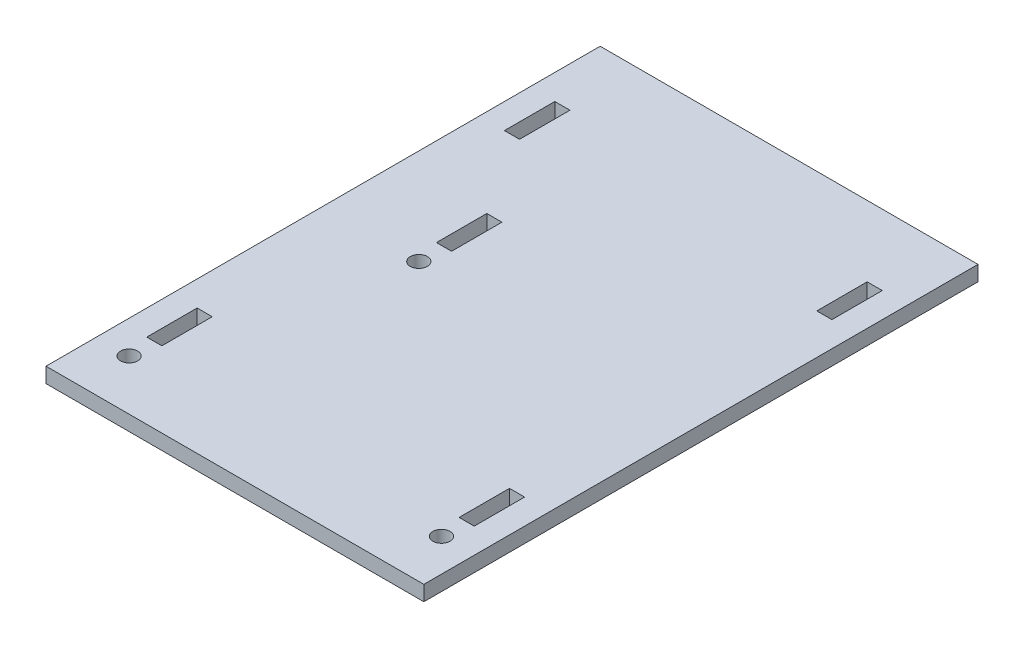
ISO-10303-21;
HEADER;
FILE_DESCRIPTION(('STEP AP214'),'2;1');
FILE_NAME('part.step','',(''),(''),'','','');
FILE_SCHEMA(('AUTOMOTIVE_DESIGN { 1 0 10303 214 1 1 1 1 }'));
ENDSEC;
DATA;
#1=APPLICATION_CONTEXT('core data for automotive mechanical design processes');
#2=APPLICATION_PROTOCOL_DEFINITION('international standard','automotive_design',2000,#1);
#3=PRODUCT_CONTEXT('',#1,'mechanical');
#4=PRODUCT('Part','Part','',(#3));
#5=PRODUCT_RELATED_PRODUCT_CATEGORY('part','',(#4));
#6=PRODUCT_DEFINITION_FORMATION('','',#4);
#7=PRODUCT_DEFINITION_CONTEXT('part definition',#1,'design');
#8=PRODUCT_DEFINITION('design','',#6,#7);
#9=PRODUCT_DEFINITION_SHAPE('','',#8);
#10=(LENGTH_UNIT() NAMED_UNIT(*) SI_UNIT(.MILLI.,.METRE.));
#11=(NAMED_UNIT(*) PLANE_ANGLE_UNIT() SI_UNIT($,.RADIAN.));
#12=(NAMED_UNIT(*) SI_UNIT($,.STERADIAN.) SOLID_ANGLE_UNIT());
#13=UNCERTAINTY_MEASURE_WITH_UNIT(LENGTH_MEASURE(1.E-05),#10,'distance_accuracy_value','');
#14=(GEOMETRIC_REPRESENTATION_CONTEXT(3) GLOBAL_UNCERTAINTY_ASSIGNED_CONTEXT((#13)) GLOBAL_UNIT_ASSIGNED_CONTEXT((#10,
#11,#12)) REPRESENTATION_CONTEXT('',''));
#15=CARTESIAN_POINT('',(0.,0.,0.));
#16=DIRECTION('',(0.,0.,1.));
#17=DIRECTION('',(1.,0.,0.));
#18=AXIS2_PLACEMENT_3D('',#15,#16,#17);
#19=CARTESIAN_POINT('',(0.,3.,0.));
#20=DIRECTION('',(1.,0.,0.));
#21=DIRECTION('',(0.,0.,-1.));
#22=AXIS2_PLACEMENT_3D('',#19,#20,#21);
#23=PLANE('',#22);
#24=DIRECTION('',(0.,0.,1.));
#25=VECTOR('',#24,1.);
#26=CARTESIAN_POINT('',(0.,0.,0.));
#27=LINE('',#26,#25);
#28=CARTESIAN_POINT('',(0.,0.,-110.));
#29=VERTEX_POINT('',#28);
#30=CARTESIAN_POINT('',(0.,0.,0.));
#31=VERTEX_POINT('',#30);
#32=EDGE_CURVE('E357',#29,#31,#27,.T.);
#33=ORIENTED_EDGE('',*,*,#32,.T.);
#34=DIRECTION('',(0.,-1.,0.));
#35=VECTOR('',#34,1.);
#36=CARTESIAN_POINT('',(0.,3.,0.));
#37=LINE('',#36,#35);
#38=CARTESIAN_POINT('',(0.,3.,0.));
#39=VERTEX_POINT('',#38);
#40=EDGE_CURVE('E11',#39,#31,#37,.T.);
#41=ORIENTED_EDGE('',*,*,#40,.F.);
#42=DIRECTION('',(0.,0.,1.));
#43=VECTOR('',#42,1.);
#44=CARTESIAN_POINT('',(0.,3.,0.));
#45=LINE('',#44,#43);
#46=CARTESIAN_POINT('',(0.,3.,-110.));
#47=VERTEX_POINT('',#46);
#48=EDGE_CURVE('E364',#47,#39,#45,.T.);
#49=ORIENTED_EDGE('',*,*,#48,.F.);
#50=DIRECTION('',(0.,-1.,0.));
#51=VECTOR('',#50,1.);
#52=CARTESIAN_POINT('',(0.,3.,-110.));
#53=LINE('',#52,#51);
#54=EDGE_CURVE('E374',#47,#29,#53,.T.);
#55=ORIENTED_EDGE('',*,*,#54,.T.);
#56=EDGE_LOOP('',(#33,#41,#49,#55));
#57=FACE_BOUND('',#56,.T.);
#58=ADVANCED_FACE('F33',(#57),#23,.F.);
#59=CARTESIAN_POINT('',(0.,3.,0.));
#60=DIRECTION('',(0.,0.,-1.));
#61=DIRECTION('',(-1.,0.,0.));
#62=AXIS2_PLACEMENT_3D('',#59,#60,#61);
#63=PLANE('',#62);
#64=DIRECTION('',(1.,0.,0.));
#65=VECTOR('',#64,1.);
#66=CARTESIAN_POINT('',(0.,0.,0.));
#67=LINE('',#66,#65);
#68=CARTESIAN_POINT('',(75.,0.,0.));
#69=VERTEX_POINT('',#68);
#70=EDGE_CURVE('E377',#31,#69,#67,.T.);
#71=ORIENTED_EDGE('',*,*,#70,.T.);
#72=DIRECTION('',(0.,-1.,0.));
#73=VECTOR('',#72,1.);
#74=CARTESIAN_POINT('',(75.,3.,0.));
#75=LINE('',#74,#73);
#76=CARTESIAN_POINT('',(75.,3.,0.));
#77=VERTEX_POINT('',#76);
#78=EDGE_CURVE('E40',#77,#69,#75,.T.);
#79=ORIENTED_EDGE('',*,*,#78,.F.);
#80=DIRECTION('',(1.,0.,0.));
#81=VECTOR('',#80,1.);
#82=CARTESIAN_POINT('',(0.,3.,0.));
#83=LINE('',#82,#81);
#84=EDGE_CURVE('E367',#39,#77,#83,.T.);
#85=ORIENTED_EDGE('',*,*,#84,.F.);
#86=ORIENTED_EDGE('',*,*,#40,.T.);
#87=EDGE_LOOP('',(#71,#79,#85,#86));
#88=FACE_BOUND('',#87,.T.);
#89=ADVANCED_FACE('F406',(#88),#63,.F.);
#90=CARTESIAN_POINT('',(75.,3.,0.));
#91=DIRECTION('',(-1.,0.,0.));
#92=DIRECTION('',(0.,0.,1.));
#93=AXIS2_PLACEMENT_3D('',#90,#91,#92);
#94=PLANE('',#93);
#95=DIRECTION('',(0.,0.,-1.));
#96=VECTOR('',#95,1.);
#97=CARTESIAN_POINT('',(75.,0.,0.));
#98=LINE('',#97,#96);
#99=CARTESIAN_POINT('',(75.,0.,-110.));
#100=VERTEX_POINT('',#99);
#101=EDGE_CURVE('E379',#69,#100,#98,.T.);
#102=ORIENTED_EDGE('',*,*,#101,.T.);
#103=DIRECTION('',(0.,-1.,0.));
#104=VECTOR('',#103,1.);
#105=CARTESIAN_POINT('',(75.,3.,-110.));
#106=LINE('',#105,#104);
#107=CARTESIAN_POINT('',(75.,3.,-110.));
#108=VERTEX_POINT('',#107);
#109=EDGE_CURVE('E384',#108,#100,#106,.T.);
#110=ORIENTED_EDGE('',*,*,#109,.F.);
#111=DIRECTION('',(0.,0.,-1.));
#112=VECTOR('',#111,1.);
#113=CARTESIAN_POINT('',(75.,3.,0.));
#114=LINE('',#113,#112);
#115=EDGE_CURVE('E370',#77,#108,#114,.T.);
#116=ORIENTED_EDGE('',*,*,#115,.F.);
#117=ORIENTED_EDGE('',*,*,#78,.T.);
#118=EDGE_LOOP('',(#102,#110,#116,#117));
#119=FACE_BOUND('',#118,.T.);
#120=ADVANCED_FACE('F391',(#119),#94,.F.);
#121=CARTESIAN_POINT('',(0.,3.,-110.));
#122=DIRECTION('',(0.,0.,1.));
#123=DIRECTION('',(1.,0.,0.));
#124=AXIS2_PLACEMENT_3D('',#121,#122,#123);
#125=PLANE('',#124);
#126=DIRECTION('',(-1.,0.,0.));
#127=VECTOR('',#126,1.);
#128=CARTESIAN_POINT('',(0.,0.,-110.));
#129=LINE('',#128,#127);
#130=EDGE_CURVE('E368',#100,#29,#129,.T.);
#131=ORIENTED_EDGE('',*,*,#130,.T.);
#132=ORIENTED_EDGE('',*,*,#54,.F.);
#133=DIRECTION('',(-1.,0.,0.));
#134=VECTOR('',#133,1.);
#135=CARTESIAN_POINT('',(0.,3.,-110.));
#136=LINE('',#135,#134);
#137=EDGE_CURVE('E372',#108,#47,#136,.T.);
#138=ORIENTED_EDGE('',*,*,#137,.F.);
#139=ORIENTED_EDGE('',*,*,#109,.T.);
#140=EDGE_LOOP('',(#131,#132,#138,#139));
#141=FACE_BOUND('',#140,.T.);
#142=ADVANCED_FACE('F399',(#141),#125,.F.);
#143=CARTESIAN_POINT('',(0.,3.,0.));
#144=DIRECTION('',(0.,-1.,0.));
#145=DIRECTION('',(0.,0.,-1.));
#146=AXIS2_PLACEMENT_3D('',#143,#144,#145);
#147=PLANE('',#146);
#148=CARTESIAN_POINT('',(6.5,3.,-9.99999999999999));
#149=DIRECTION('',(0.,1.,0.));
#150=DIRECTION('',(0.,0.,1.));
#151=AXIS2_PLACEMENT_3D('',#148,#149,#150);
#152=CIRCLE('',#151,1.69999999999999);
#153=CARTESIAN_POINT('',(6.5,3.,-8.30000000000001));
#154=VERTEX_POINT('',#153);
#155=EDGE_CURVE('E515',#154,#154,#152,.T.);
#156=ORIENTED_EDGE('',*,*,#155,.F.);
#157=EDGE_LOOP('',(#156));
#158=FACE_BOUND('',#157,.T.);
#159=CARTESIAN_POINT('',(68.5,3.,-10.));
#160=DIRECTION('',(0.,1.,0.));
#161=DIRECTION('',(0.,0.,1.));
#162=AXIS2_PLACEMENT_3D('',#159,#160,#161);
#163=CIRCLE('',#162,1.69999999999999);
#164=CARTESIAN_POINT('',(68.5,3.,-8.30000000000001));
#165=VERTEX_POINT('',#164);
#166=EDGE_CURVE('E517',#165,#165,#163,.T.);
#167=ORIENTED_EDGE('',*,*,#166,.F.);
#168=EDGE_LOOP('',(#167));
#169=FACE_BOUND('',#168,.T.);
#170=CARTESIAN_POINT('',(19.,3.,-55.));
#171=DIRECTION('',(0.,1.,0.));
#172=DIRECTION('',(0.,0.,1.));
#173=AXIS2_PLACEMENT_3D('',#170,#171,#172);
#174=CIRCLE('',#173,1.69999999999999);
#175=CARTESIAN_POINT('',(19.,3.,-53.3));
#176=VERTEX_POINT('',#175);
#177=EDGE_CURVE('E524',#176,#176,#174,.T.);
#178=ORIENTED_EDGE('',*,*,#177,.F.);
#179=EDGE_LOOP('',(#178));
#180=FACE_BOUND('',#179,.T.);
#181=DIRECTION('',(1.,0.,0.));
#182=VECTOR('',#181,1.);
#183=CARTESIAN_POINT('',(5.00000000000011,3.,-15.));
#184=LINE('',#183,#182);
#185=CARTESIAN_POINT('',(5.00000000000011,3.,-15.));
#186=VERTEX_POINT('',#185);
#187=CARTESIAN_POINT('',(8.00000000000011,3.,-15.));
#188=VERTEX_POINT('',#187);
#189=EDGE_CURVE('E318',#186,#188,#184,.T.);
#190=ORIENTED_EDGE('',*,*,#189,.F.);
#191=DIRECTION('',(0.,0.,1.));
#192=VECTOR('',#191,1.);
#193=CARTESIAN_POINT('',(5.00000000000011,3.,-25.));
#194=LINE('',#193,#192);
#195=CARTESIAN_POINT('',(5.00000000000011,3.,-25.));
#196=VERTEX_POINT('',#195);
#197=EDGE_CURVE('E47',#196,#186,#194,.T.);
#198=ORIENTED_EDGE('',*,*,#197,.F.);
#199=DIRECTION('',(-1.,0.,0.));
#200=VECTOR('',#199,1.);
#201=CARTESIAN_POINT('',(5.00000000000011,3.,-25.));
#202=LINE('',#201,#200);
#203=CARTESIAN_POINT('',(8.00000000000011,3.,-25.));
#204=VERTEX_POINT('',#203);
#205=EDGE_CURVE('E307',#204,#196,#202,.T.);
#206=ORIENTED_EDGE('',*,*,#205,.F.);
#207=DIRECTION('',(0.,0.,-1.));
#208=VECTOR('',#207,1.);
#209=CARTESIAN_POINT('',(8.00000000000011,3.,-25.));
#210=LINE('',#209,#208);
#211=EDGE_CURVE('E321',#188,#204,#210,.T.);
#212=ORIENTED_EDGE('',*,*,#211,.F.);
#213=EDGE_LOOP('',(#190,#198,#206,#212));
#214=FACE_BOUND('',#213,.T.);
#215=DIRECTION('',(1.,0.,0.));
#216=VECTOR('',#215,1.);
#217=CARTESIAN_POINT('',(67.,3.,-14.9999999999998));
#218=LINE('',#217,#216);
#219=CARTESIAN_POINT('',(67.,3.,-14.9999999999998));
#220=VERTEX_POINT('',#219);
#221=CARTESIAN_POINT('',(70.,3.,-14.9999999999998));
#222=VERTEX_POINT('',#221);
#223=EDGE_CURVE('E288',#220,#222,#218,.T.);
#224=ORIENTED_EDGE('',*,*,#223,.F.);
#225=DIRECTION('',(0.,0.,1.));
#226=VECTOR('',#225,1.);
#227=CARTESIAN_POINT('',(67.,3.,-24.9999999999998));
#228=LINE('',#227,#226);
#229=CARTESIAN_POINT('',(67.,3.,-24.9999999999998));
#230=VERTEX_POINT('',#229);
#231=EDGE_CURVE('E55',#230,#220,#228,.T.);
#232=ORIENTED_EDGE('',*,*,#231,.F.);
#233=DIRECTION('',(-1.,0.,0.));
#234=VECTOR('',#233,1.);
#235=CARTESIAN_POINT('',(67.,3.,-24.9999999999998));
#236=LINE('',#235,#234);
#237=CARTESIAN_POINT('',(70.,3.,-24.9999999999998));
#238=VERTEX_POINT('',#237);
#239=EDGE_CURVE('E277',#238,#230,#236,.T.);
#240=ORIENTED_EDGE('',*,*,#239,.F.);
#241=DIRECTION('',(0.,0.,-1.));
#242=VECTOR('',#241,1.);
#243=CARTESIAN_POINT('',(70.,3.,-24.9999999999998));
#244=LINE('',#243,#242);
#245=EDGE_CURVE('E292',#222,#238,#244,.T.);
#246=ORIENTED_EDGE('',*,*,#245,.F.);
#247=EDGE_LOOP('',(#224,#232,#240,#246));
#248=FACE_BOUND('',#247,.T.);
#249=DIRECTION('',(1.,0.,0.));
#250=VECTOR('',#249,1.);
#251=CARTESIAN_POINT('',(67.0000000002227,3.,-85.9999999999979));
#252=LINE('',#251,#250);
#253=CARTESIAN_POINT('',(67.0000000002227,3.,-85.9999999999979));
#254=VERTEX_POINT('',#253);
#255=CARTESIAN_POINT('',(70.0000000002227,3.,-85.9999999999979));
#256=VERTEX_POINT('',#255);
#257=EDGE_CURVE('E257',#254,#256,#252,.T.);
#258=ORIENTED_EDGE('',*,*,#257,.F.);
#259=DIRECTION('',(0.,0.,1.));
#260=VECTOR('',#259,1.);
#261=CARTESIAN_POINT('',(67.0000000002227,3.,-95.9999999999979));
#262=LINE('',#261,#260);
#263=CARTESIAN_POINT('',(67.0000000002227,3.,-95.9999999999979));
#264=VERTEX_POINT('',#263);
#265=EDGE_CURVE('E255',#264,#254,#262,.T.);
#266=ORIENTED_EDGE('',*,*,#265,.F.);
#267=DIRECTION('',(-1.,0.,0.));
#268=VECTOR('',#267,1.);
#269=CARTESIAN_POINT('',(67.0000000002227,3.,-95.9999999999979));
#270=LINE('',#269,#268);
#271=CARTESIAN_POINT('',(70.0000000002227,3.,-95.9999999999979));
#272=VERTEX_POINT('',#271);
#273=EDGE_CURVE('E245',#272,#264,#270,.T.);
#274=ORIENTED_EDGE('',*,*,#273,.F.);
#275=DIRECTION('',(0.,0.,-1.));
#276=VECTOR('',#275,1.);
#277=CARTESIAN_POINT('',(70.0000000002227,3.,-95.9999999999979));
#278=LINE('',#277,#276);
#279=EDGE_CURVE('E261',#256,#272,#278,.T.);
#280=ORIENTED_EDGE('',*,*,#279,.F.);
#281=EDGE_LOOP('',(#258,#266,#274,#280));
#282=FACE_BOUND('',#281,.T.);
#283=DIRECTION('',(-1.,0.,0.));
#284=VECTOR('',#283,1.);
#285=CARTESIAN_POINT('',(20.499999999949,3.,-70.0000000000143));
#286=LINE('',#285,#284);
#287=CARTESIAN_POINT('',(20.499999999949,3.,-70.0000000000143));
#288=VERTEX_POINT('',#287);
#289=CARTESIAN_POINT('',(17.499999999949,3.,-70.0000000000143));
#290=VERTEX_POINT('',#289);
#291=EDGE_CURVE('E230',#288,#290,#286,.T.);
#292=ORIENTED_EDGE('',*,*,#291,.F.);
#293=DIRECTION('',(0.,0.,-1.));
#294=VECTOR('',#293,1.);
#295=CARTESIAN_POINT('',(20.499999999949,3.,-60.0000000000143));
#296=LINE('',#295,#294);
#297=CARTESIAN_POINT('',(20.499999999949,3.,-60.0000000000143));
#298=VERTEX_POINT('',#297);
#299=EDGE_CURVE('E200',#298,#288,#296,.T.);
#300=ORIENTED_EDGE('',*,*,#299,.F.);
#301=DIRECTION('',(1.,0.,0.));
#302=VECTOR('',#301,1.);
#303=CARTESIAN_POINT('',(20.499999999949,3.,-60.0000000000143));
#304=LINE('',#303,#302);
#305=CARTESIAN_POINT('',(17.499999999949,3.,-60.0000000000143));
#306=VERTEX_POINT('',#305);
#307=EDGE_CURVE('E218',#306,#298,#304,.T.);
#308=ORIENTED_EDGE('',*,*,#307,.F.);
#309=DIRECTION('',(0.,0.,1.));
#310=VECTOR('',#309,1.);
#311=CARTESIAN_POINT('',(17.499999999949,3.,-60.0000000000143));
#312=LINE('',#311,#310);
#313=EDGE_CURVE('E221',#290,#306,#312,.T.);
#314=ORIENTED_EDGE('',*,*,#313,.F.);
#315=EDGE_LOOP('',(#292,#300,#308,#314));
#316=FACE_BOUND('',#315,.T.);
#317=DIRECTION('',(1.,0.,0.));
#318=VECTOR('',#317,1.);
#319=CARTESIAN_POINT('',(4.99999999995264,3.,-86.0000000000131));
#320=LINE('',#319,#318);
#321=CARTESIAN_POINT('',(4.99999999995264,3.,-86.0000000000131));
#322=VERTEX_POINT('',#321);
#323=CARTESIAN_POINT('',(7.99999999995265,3.,-86.0000000000131));
#324=VERTEX_POINT('',#323);
#325=EDGE_CURVE('E347',#322,#324,#320,.T.);
#326=ORIENTED_EDGE('',*,*,#325,.F.);
#327=DIRECTION('',(0.,0.,1.));
#328=VECTOR('',#327,1.);
#329=CARTESIAN_POINT('',(4.99999999995265,3.,-96.0000000000131));
#330=LINE('',#329,#328);
#331=CARTESIAN_POINT('',(4.99999999995265,3.,-96.0000000000131));
#332=VERTEX_POINT('',#331);
#333=EDGE_CURVE('E237',#332,#322,#330,.T.);
#334=ORIENTED_EDGE('',*,*,#333,.F.);
#335=DIRECTION('',(-1.,0.,0.));
#336=VECTOR('',#335,1.);
#337=CARTESIAN_POINT('',(4.99999999995265,3.,-96.0000000000131));
#338=LINE('',#337,#336);
#339=CARTESIAN_POINT('',(7.99999999995264,3.,-96.0000000000131));
#340=VERTEX_POINT('',#339);
#341=EDGE_CURVE('E336',#340,#332,#338,.T.);
#342=ORIENTED_EDGE('',*,*,#341,.F.);
#343=DIRECTION('',(0.,0.,-1.));
#344=VECTOR('',#343,1.);
#345=CARTESIAN_POINT('',(7.99999999995264,3.,-96.0000000000131));
#346=LINE('',#345,#344);
#347=EDGE_CURVE('E350',#324,#340,#346,.T.);
#348=ORIENTED_EDGE('',*,*,#347,.F.);
#349=EDGE_LOOP('',(#326,#334,#342,#348));
#350=FACE_BOUND('',#349,.T.);
#351=ORIENTED_EDGE('',*,*,#48,.T.);
#352=ORIENTED_EDGE('',*,*,#84,.T.);
#353=ORIENTED_EDGE('',*,*,#115,.T.);
#354=ORIENTED_EDGE('',*,*,#137,.T.);
#355=EDGE_LOOP('',(#351,#352,#353,#354));
#356=FACE_BOUND('',#355,.T.);
#357=ADVANCED_FACE('F405',(#158,#169,#180,#214,#248,#282,#316,#350,#356),#147,.F.);
#358=CARTESIAN_POINT('',(0.,0.,0.));
#359=DIRECTION('',(0.,-1.,0.));
#360=DIRECTION('',(0.,0.,-1.));
#361=AXIS2_PLACEMENT_3D('',#358,#359,#360);
#362=PLANE('',#361);
#363=CARTESIAN_POINT('',(6.5,0.,-9.99999999999999));
#364=DIRECTION('',(0.,1.,0.));
#365=DIRECTION('',(0.,0.,1.));
#366=AXIS2_PLACEMENT_3D('',#363,#364,#365);
#367=CIRCLE('',#366,1.69999999999999);
#368=CARTESIAN_POINT('',(6.5,0.,-8.30000000000001));
#369=VERTEX_POINT('',#368);
#370=EDGE_CURVE('E512',#369,#369,#367,.T.);
#371=ORIENTED_EDGE('',*,*,#370,.T.);
#372=EDGE_LOOP('',(#371));
#373=FACE_BOUND('',#372,.T.);
#374=CARTESIAN_POINT('',(68.5,0.,-10.));
#375=DIRECTION('',(0.,1.,0.));
#376=DIRECTION('',(0.,0.,1.));
#377=AXIS2_PLACEMENT_3D('',#374,#375,#376);
#378=CIRCLE('',#377,1.69999999999999);
#379=CARTESIAN_POINT('',(68.5,0.,-8.30000000000001));
#380=VERTEX_POINT('',#379);
#381=EDGE_CURVE('E522',#380,#380,#378,.T.);
#382=ORIENTED_EDGE('',*,*,#381,.T.);
#383=EDGE_LOOP('',(#382));
#384=FACE_BOUND('',#383,.T.);
#385=CARTESIAN_POINT('',(19.,0.,-55.));
#386=DIRECTION('',(0.,1.,0.));
#387=DIRECTION('',(0.,0.,1.));
#388=AXIS2_PLACEMENT_3D('',#385,#386,#387);
#389=CIRCLE('',#388,1.69999999999999);
#390=CARTESIAN_POINT('',(19.,0.,-53.3));
#391=VERTEX_POINT('',#390);
#392=EDGE_CURVE('E224',#391,#391,#389,.T.);
#393=ORIENTED_EDGE('',*,*,#392,.T.);
#394=EDGE_LOOP('',(#393));
#395=FACE_BOUND('',#394,.T.);
#396=DIRECTION('',(0.,0.,1.));
#397=VECTOR('',#396,1.);
#398=CARTESIAN_POINT('',(5.00000000000011,0.,-25.));
#399=LINE('',#398,#397);
#400=CARTESIAN_POINT('',(5.00000000000011,0.,-25.));
#401=VERTEX_POINT('',#400);
#402=CARTESIAN_POINT('',(5.00000000000011,0.,-15.));
#403=VERTEX_POINT('',#402);
#404=EDGE_CURVE('E303',#401,#403,#399,.T.);
#405=ORIENTED_EDGE('',*,*,#404,.T.);
#406=DIRECTION('',(1.,0.,0.));
#407=VECTOR('',#406,1.);
#408=CARTESIAN_POINT('',(5.00000000000011,0.,-15.));
#409=LINE('',#408,#407);
#410=CARTESIAN_POINT('',(8.00000000000011,0.,-15.));
#411=VERTEX_POINT('',#410);
#412=EDGE_CURVE('E306',#403,#411,#409,.T.);
#413=ORIENTED_EDGE('',*,*,#412,.T.);
#414=DIRECTION('',(0.,0.,-1.));
#415=VECTOR('',#414,1.);
#416=CARTESIAN_POINT('',(8.00000000000011,0.,-25.));
#417=LINE('',#416,#415);
#418=CARTESIAN_POINT('',(8.00000000000011,0.,-25.));
#419=VERTEX_POINT('',#418);
#420=EDGE_CURVE('E310',#411,#419,#417,.T.);
#421=ORIENTED_EDGE('',*,*,#420,.T.);
#422=DIRECTION('',(-1.,0.,0.));
#423=VECTOR('',#422,1.);
#424=CARTESIAN_POINT('',(5.00000000000011,0.,-25.));
#425=LINE('',#424,#423);
#426=EDGE_CURVE('E313',#419,#401,#425,.T.);
#427=ORIENTED_EDGE('',*,*,#426,.T.);
#428=EDGE_LOOP('',(#405,#413,#421,#427));
#429=FACE_BOUND('',#428,.T.);
#430=DIRECTION('',(0.,0.,1.));
#431=VECTOR('',#430,1.);
#432=CARTESIAN_POINT('',(67.,0.,-24.9999999999998));
#433=LINE('',#432,#431);
#434=CARTESIAN_POINT('',(67.,0.,-24.9999999999998));
#435=VERTEX_POINT('',#434);
#436=CARTESIAN_POINT('',(67.,0.,-14.9999999999998));
#437=VERTEX_POINT('',#436);
#438=EDGE_CURVE('E273',#435,#437,#433,.T.);
#439=ORIENTED_EDGE('',*,*,#438,.T.);
#440=DIRECTION('',(1.,0.,0.));
#441=VECTOR('',#440,1.);
#442=CARTESIAN_POINT('',(67.,0.,-14.9999999999998));
#443=LINE('',#442,#441);
#444=CARTESIAN_POINT('',(70.,0.,-14.9999999999998));
#445=VERTEX_POINT('',#444);
#446=EDGE_CURVE('E276',#437,#445,#443,.T.);
#447=ORIENTED_EDGE('',*,*,#446,.T.);
#448=DIRECTION('',(0.,0.,-1.));
#449=VECTOR('',#448,1.);
#450=CARTESIAN_POINT('',(70.,0.,-24.9999999999998));
#451=LINE('',#450,#449);
#452=CARTESIAN_POINT('',(70.,0.,-24.9999999999998));
#453=VERTEX_POINT('',#452);
#454=EDGE_CURVE('E280',#445,#453,#451,.T.);
#455=ORIENTED_EDGE('',*,*,#454,.T.);
#456=DIRECTION('',(-1.,0.,0.));
#457=VECTOR('',#456,1.);
#458=CARTESIAN_POINT('',(67.,0.,-24.9999999999998));
#459=LINE('',#458,#457);
#460=EDGE_CURVE('E283',#453,#435,#459,.T.);
#461=ORIENTED_EDGE('',*,*,#460,.T.);
#462=EDGE_LOOP('',(#439,#447,#455,#461));
#463=FACE_BOUND('',#462,.T.);
#464=DIRECTION('',(0.,0.,1.));
#465=VECTOR('',#464,1.);
#466=CARTESIAN_POINT('',(67.0000000002227,0.,-95.9999999999979));
#467=LINE('',#466,#465);
#468=CARTESIAN_POINT('',(67.0000000002227,0.,-95.9999999999979));
#469=VERTEX_POINT('',#468);
#470=CARTESIAN_POINT('',(67.0000000002227,0.,-85.9999999999979));
#471=VERTEX_POINT('',#470);
#472=EDGE_CURVE('E241',#469,#471,#467,.T.);
#473=ORIENTED_EDGE('',*,*,#472,.T.);
#474=DIRECTION('',(1.,0.,0.));
#475=VECTOR('',#474,1.);
#476=CARTESIAN_POINT('',(67.0000000002227,0.,-85.9999999999979));
#477=LINE('',#476,#475);
#478=CARTESIAN_POINT('',(70.0000000002227,0.,-85.9999999999979));
#479=VERTEX_POINT('',#478);
#480=EDGE_CURVE('E244',#471,#479,#477,.T.);
#481=ORIENTED_EDGE('',*,*,#480,.T.);
#482=DIRECTION('',(0.,0.,-1.));
#483=VECTOR('',#482,1.);
#484=CARTESIAN_POINT('',(70.0000000002227,0.,-95.9999999999979));
#485=LINE('',#484,#483);
#486=CARTESIAN_POINT('',(70.0000000002227,0.,-95.9999999999979));
#487=VERTEX_POINT('',#486);
#488=EDGE_CURVE('E248',#479,#487,#485,.T.);
#489=ORIENTED_EDGE('',*,*,#488,.T.);
#490=DIRECTION('',(-1.,0.,0.));
#491=VECTOR('',#490,1.);
#492=CARTESIAN_POINT('',(67.0000000002227,0.,-95.9999999999979));
#493=LINE('',#492,#491);
#494=EDGE_CURVE('E251',#487,#469,#493,.T.);
#495=ORIENTED_EDGE('',*,*,#494,.T.);
#496=EDGE_LOOP('',(#473,#481,#489,#495));
#497=FACE_BOUND('',#496,.T.);
#498=DIRECTION('',(0.,0.,-1.));
#499=VECTOR('',#498,1.);
#500=CARTESIAN_POINT('',(20.499999999949,0.,-60.0000000000143));
#501=LINE('',#500,#499);
#502=CARTESIAN_POINT('',(20.499999999949,0.,-60.0000000000143));
#503=VERTEX_POINT('',#502);
#504=CARTESIAN_POINT('',(20.499999999949,0.,-70.0000000000143));
#505=VERTEX_POINT('',#504);
#506=EDGE_CURVE('E197',#503,#505,#501,.T.);
#507=ORIENTED_EDGE('',*,*,#506,.T.);
#508=DIRECTION('',(-1.,0.,0.));
#509=VECTOR('',#508,1.);
#510=CARTESIAN_POINT('',(20.499999999949,0.,-70.0000000000143));
#511=LINE('',#510,#509);
#512=CARTESIAN_POINT('',(17.499999999949,0.,-70.0000000000143));
#513=VERTEX_POINT('',#512);
#514=EDGE_CURVE('E209',#505,#513,#511,.T.);
#515=ORIENTED_EDGE('',*,*,#514,.T.);
#516=DIRECTION('',(0.,0.,1.));
#517=VECTOR('',#516,1.);
#518=CARTESIAN_POINT('',(17.499999999949,0.,-60.0000000000143));
#519=LINE('',#518,#517);
#520=CARTESIAN_POINT('',(17.499999999949,0.,-60.0000000000143));
#521=VERTEX_POINT('',#520);
#522=EDGE_CURVE('E213',#513,#521,#519,.T.);
#523=ORIENTED_EDGE('',*,*,#522,.T.);
#524=DIRECTION('',(1.,0.,0.));
#525=VECTOR('',#524,1.);
#526=CARTESIAN_POINT('',(20.499999999949,0.,-60.0000000000143));
#527=LINE('',#526,#525);
#528=EDGE_CURVE('E205',#521,#503,#527,.T.);
#529=ORIENTED_EDGE('',*,*,#528,.T.);
#530=EDGE_LOOP('',(#507,#515,#523,#529));
#531=FACE_BOUND('',#530,.T.);
#532=DIRECTION('',(0.,0.,1.));
#533=VECTOR('',#532,1.);
#534=CARTESIAN_POINT('',(4.99999999995265,0.,-96.0000000000131));
#535=LINE('',#534,#533);
#536=CARTESIAN_POINT('',(4.99999999995265,0.,-96.0000000000131));
#537=VERTEX_POINT('',#536);
#538=CARTESIAN_POINT('',(4.99999999995264,0.,-86.0000000000131));
#539=VERTEX_POINT('',#538);
#540=EDGE_CURVE('E332',#537,#539,#535,.T.);
#541=ORIENTED_EDGE('',*,*,#540,.T.);
#542=DIRECTION('',(1.,0.,0.));
#543=VECTOR('',#542,1.);
#544=CARTESIAN_POINT('',(4.99999999995264,0.,-86.0000000000131));
#545=LINE('',#544,#543);
#546=CARTESIAN_POINT('',(7.99999999995265,0.,-86.0000000000131));
#547=VERTEX_POINT('',#546);
#548=EDGE_CURVE('E335',#539,#547,#545,.T.);
#549=ORIENTED_EDGE('',*,*,#548,.T.);
#550=DIRECTION('',(0.,0.,-1.));
#551=VECTOR('',#550,1.);
#552=CARTESIAN_POINT('',(7.99999999995264,0.,-96.0000000000131));
#553=LINE('',#552,#551);
#554=CARTESIAN_POINT('',(7.99999999995264,0.,-96.0000000000131));
#555=VERTEX_POINT('',#554);
#556=EDGE_CURVE('E339',#547,#555,#553,.T.);
#557=ORIENTED_EDGE('',*,*,#556,.T.);
#558=DIRECTION('',(-1.,0.,0.));
#559=VECTOR('',#558,1.);
#560=CARTESIAN_POINT('',(4.99999999995265,0.,-96.0000000000131));
#561=LINE('',#560,#559);
#562=EDGE_CURVE('E342',#555,#537,#561,.T.);
#563=ORIENTED_EDGE('',*,*,#562,.T.);
#564=EDGE_LOOP('',(#541,#549,#557,#563));
#565=FACE_BOUND('',#564,.T.);
#566=ORIENTED_EDGE('',*,*,#32,.F.);
#567=ORIENTED_EDGE('',*,*,#130,.F.);
#568=ORIENTED_EDGE('',*,*,#101,.F.);
#569=ORIENTED_EDGE('',*,*,#70,.F.);
#570=EDGE_LOOP('',(#566,#567,#568,#569));
#571=FACE_BOUND('',#570,.T.);
#572=ADVANCED_FACE('F215',(#373,#384,#395,#429,#463,#497,#531,#565,#571),#362,.T.);
#573=CARTESIAN_POINT('',(4.99999999995265,0.,-96.0000000000131));
#574=DIRECTION('',(-1.,0.,0.));
#575=DIRECTION('',(0.,0.,1.));
#576=AXIS2_PLACEMENT_3D('',#573,#574,#575);
#577=PLANE('',#576);
#578=ORIENTED_EDGE('',*,*,#333,.T.);
#579=DIRECTION('',(0.,1.,0.));
#580=VECTOR('',#579,1.);
#581=CARTESIAN_POINT('',(4.99999999995264,0.,-86.0000000000131));
#582=LINE('',#581,#580);
#583=EDGE_CURVE('E345',#539,#322,#582,.T.);
#584=ORIENTED_EDGE('',*,*,#583,.F.);
#585=ORIENTED_EDGE('',*,*,#540,.F.);
#586=DIRECTION('',(0.,1.,0.));
#587=VECTOR('',#586,1.);
#588=CARTESIAN_POINT('',(4.99999999995265,0.,-96.0000000000131));
#589=LINE('',#588,#587);
#590=EDGE_CURVE('E355',#537,#332,#589,.T.);
#591=ORIENTED_EDGE('',*,*,#590,.T.);
#592=EDGE_LOOP('',(#578,#584,#585,#591));
#593=FACE_BOUND('',#592,.T.);
#594=ADVANCED_FACE('F418',(#593),#577,.F.);
#595=CARTESIAN_POINT('',(4.99999999995265,0.,-96.0000000000131));
#596=DIRECTION('',(0.,0.,-1.));
#597=DIRECTION('',(-1.,0.,0.));
#598=AXIS2_PLACEMENT_3D('',#595,#596,#597);
#599=PLANE('',#598);
#600=ORIENTED_EDGE('',*,*,#341,.T.);
#601=ORIENTED_EDGE('',*,*,#590,.F.);
#602=ORIENTED_EDGE('',*,*,#562,.F.);
#603=DIRECTION('',(0.,1.,0.));
#604=VECTOR('',#603,1.);
#605=CARTESIAN_POINT('',(7.99999999995264,0.,-96.0000000000131));
#606=LINE('',#605,#604);
#607=EDGE_CURVE('E358',#555,#340,#606,.T.);
#608=ORIENTED_EDGE('',*,*,#607,.T.);
#609=EDGE_LOOP('',(#600,#601,#602,#608));
#610=FACE_BOUND('',#609,.T.);
#611=ADVANCED_FACE('F425',(#610),#599,.F.);
#612=CARTESIAN_POINT('',(7.99999999995264,0.,-96.0000000000131));
#613=DIRECTION('',(1.,0.,0.));
#614=DIRECTION('',(0.,0.,-1.));
#615=AXIS2_PLACEMENT_3D('',#612,#613,#614);
#616=PLANE('',#615);
#617=ORIENTED_EDGE('',*,*,#347,.T.);
#618=ORIENTED_EDGE('',*,*,#607,.F.);
#619=ORIENTED_EDGE('',*,*,#556,.F.);
#620=DIRECTION('',(0.,1.,0.));
#621=VECTOR('',#620,1.);
#622=CARTESIAN_POINT('',(7.99999999995265,0.,-86.0000000000131));
#623=LINE('',#622,#621);
#624=EDGE_CURVE('E360',#547,#324,#623,.T.);
#625=ORIENTED_EDGE('',*,*,#624,.T.);
#626=EDGE_LOOP('',(#617,#618,#619,#625));
#627=FACE_BOUND('',#626,.T.);
#628=ADVANCED_FACE('F430',(#627),#616,.F.);
#629=CARTESIAN_POINT('',(4.99999999995264,0.,-86.0000000000131));
#630=DIRECTION('',(0.,0.,1.));
#631=DIRECTION('',(1.,0.,0.));
#632=AXIS2_PLACEMENT_3D('',#629,#630,#631);
#633=PLANE('',#632);
#634=ORIENTED_EDGE('',*,*,#325,.T.);
#635=ORIENTED_EDGE('',*,*,#624,.F.);
#636=ORIENTED_EDGE('',*,*,#548,.F.);
#637=ORIENTED_EDGE('',*,*,#583,.T.);
#638=EDGE_LOOP('',(#634,#635,#636,#637));
#639=FACE_BOUND('',#638,.T.);
#640=ADVANCED_FACE('F427',(#639),#633,.F.);
#641=CARTESIAN_POINT('',(20.499999999949,0.,-60.0000000000143));
#642=DIRECTION('',(1.,0.,0.));
#643=DIRECTION('',(0.,0.,-1.));
#644=AXIS2_PLACEMENT_3D('',#641,#642,#643);
#645=PLANE('',#644);
#646=ORIENTED_EDGE('',*,*,#299,.T.);
#647=DIRECTION('',(0.,1.,0.));
#648=VECTOR('',#647,1.);
#649=CARTESIAN_POINT('',(20.499999999949,0.,-70.0000000000143));
#650=LINE('',#649,#648);
#651=EDGE_CURVE('E193',#505,#288,#650,.T.);
#652=ORIENTED_EDGE('',*,*,#651,.F.);
#653=ORIENTED_EDGE('',*,*,#506,.F.);
#654=DIRECTION('',(0.,1.,0.));
#655=VECTOR('',#654,1.);
#656=CARTESIAN_POINT('',(20.499999999949,0.,-60.0000000000143));
#657=LINE('',#656,#655);
#658=EDGE_CURVE('E235',#503,#298,#657,.T.);
#659=ORIENTED_EDGE('',*,*,#658,.T.);
#660=EDGE_LOOP('',(#646,#652,#653,#659));
#661=FACE_BOUND('',#660,.T.);
#662=ADVANCED_FACE('F195',(#661),#645,.F.);
#663=CARTESIAN_POINT('',(20.499999999949,0.,-60.0000000000143));
#664=DIRECTION('',(0.,0.,1.));
#665=DIRECTION('',(1.,0.,0.));
#666=AXIS2_PLACEMENT_3D('',#663,#664,#665);
#667=PLANE('',#666);
#668=ORIENTED_EDGE('',*,*,#307,.T.);
#669=ORIENTED_EDGE('',*,*,#658,.F.);
#670=ORIENTED_EDGE('',*,*,#528,.F.);
#671=DIRECTION('',(0.,1.,0.));
#672=VECTOR('',#671,1.);
#673=CARTESIAN_POINT('',(17.499999999949,0.,-60.0000000000143));
#674=LINE('',#673,#672);
#675=EDGE_CURVE('E238',#521,#306,#674,.T.);
#676=ORIENTED_EDGE('',*,*,#675,.T.);
#677=EDGE_LOOP('',(#668,#669,#670,#676));
#678=FACE_BOUND('',#677,.T.);
#679=ADVANCED_FACE('F487',(#678),#667,.F.);
#680=CARTESIAN_POINT('',(17.499999999949,0.,-60.0000000000143));
#681=DIRECTION('',(-1.,0.,0.));
#682=DIRECTION('',(0.,0.,1.));
#683=AXIS2_PLACEMENT_3D('',#680,#681,#682);
#684=PLANE('',#683);
#685=ORIENTED_EDGE('',*,*,#313,.T.);
#686=ORIENTED_EDGE('',*,*,#675,.F.);
#687=ORIENTED_EDGE('',*,*,#522,.F.);
#688=DIRECTION('',(0.,1.,0.));
#689=VECTOR('',#688,1.);
#690=CARTESIAN_POINT('',(17.499999999949,0.,-70.0000000000143));
#691=LINE('',#690,#689);
#692=EDGE_CURVE('E204',#513,#290,#691,.T.);
#693=ORIENTED_EDGE('',*,*,#692,.T.);
#694=EDGE_LOOP('',(#685,#686,#687,#693));
#695=FACE_BOUND('',#694,.T.);
#696=ADVANCED_FACE('F490',(#695),#684,.F.);
#697=CARTESIAN_POINT('',(20.499999999949,0.,-70.0000000000143));
#698=DIRECTION('',(0.,0.,-1.));
#699=DIRECTION('',(-1.,0.,0.));
#700=AXIS2_PLACEMENT_3D('',#697,#698,#699);
#701=PLANE('',#700);
#702=ORIENTED_EDGE('',*,*,#291,.T.);
#703=ORIENTED_EDGE('',*,*,#692,.F.);
#704=ORIENTED_EDGE('',*,*,#514,.F.);
#705=ORIENTED_EDGE('',*,*,#651,.T.);
#706=EDGE_LOOP('',(#702,#703,#704,#705));
#707=FACE_BOUND('',#706,.T.);
#708=ADVANCED_FACE('F210',(#707),#701,.F.);
#709=CARTESIAN_POINT('',(67.0000000002227,0.,-95.9999999999979));
#710=DIRECTION('',(-1.,0.,0.));
#711=DIRECTION('',(0.,0.,1.));
#712=AXIS2_PLACEMENT_3D('',#709,#710,#711);
#713=PLANE('',#712);
#714=ORIENTED_EDGE('',*,*,#265,.T.);
#715=DIRECTION('',(0.,1.,0.));
#716=VECTOR('',#715,1.);
#717=CARTESIAN_POINT('',(67.0000000002227,0.,-85.9999999999979));
#718=LINE('',#717,#716);
#719=EDGE_CURVE('E254',#471,#254,#718,.T.);
#720=ORIENTED_EDGE('',*,*,#719,.F.);
#721=ORIENTED_EDGE('',*,*,#472,.F.);
#722=DIRECTION('',(0.,1.,0.));
#723=VECTOR('',#722,1.);
#724=CARTESIAN_POINT('',(67.0000000002227,0.,-95.9999999999979));
#725=LINE('',#724,#723);
#726=EDGE_CURVE('E231',#469,#264,#725,.T.);
#727=ORIENTED_EDGE('',*,*,#726,.T.);
#728=EDGE_LOOP('',(#714,#720,#721,#727));
#729=FACE_BOUND('',#728,.T.);
#730=ADVANCED_FACE('F470',(#729),#713,.F.);
#731=CARTESIAN_POINT('',(67.0000000002227,0.,-95.9999999999979));
#732=DIRECTION('',(0.,0.,-1.));
#733=DIRECTION('',(-1.,0.,0.));
#734=AXIS2_PLACEMENT_3D('',#731,#732,#733);
#735=PLANE('',#734);
#736=ORIENTED_EDGE('',*,*,#273,.T.);
#737=ORIENTED_EDGE('',*,*,#726,.F.);
#738=ORIENTED_EDGE('',*,*,#494,.F.);
#739=DIRECTION('',(0.,1.,0.));
#740=VECTOR('',#739,1.);
#741=CARTESIAN_POINT('',(70.0000000002227,0.,-95.9999999999979));
#742=LINE('',#741,#740);
#743=EDGE_CURVE('E267',#487,#272,#742,.T.);
#744=ORIENTED_EDGE('',*,*,#743,.T.);
#745=EDGE_LOOP('',(#736,#737,#738,#744));
#746=FACE_BOUND('',#745,.T.);
#747=ADVANCED_FACE('F473',(#746),#735,.F.);
#748=CARTESIAN_POINT('',(70.0000000002227,0.,-95.9999999999979));
#749=DIRECTION('',(1.,0.,0.));
#750=DIRECTION('',(0.,0.,-1.));
#751=AXIS2_PLACEMENT_3D('',#748,#749,#750);
#752=PLANE('',#751);
#753=ORIENTED_EDGE('',*,*,#279,.T.);
#754=ORIENTED_EDGE('',*,*,#743,.F.);
#755=ORIENTED_EDGE('',*,*,#488,.F.);
#756=DIRECTION('',(0.,1.,0.));
#757=VECTOR('',#756,1.);
#758=CARTESIAN_POINT('',(70.0000000002227,0.,-85.9999999999979));
#759=LINE('',#758,#757);
#760=EDGE_CURVE('E269',#479,#256,#759,.T.);
#761=ORIENTED_EDGE('',*,*,#760,.T.);
#762=EDGE_LOOP('',(#753,#754,#755,#761));
#763=FACE_BOUND('',#762,.T.);
#764=ADVANCED_FACE('F477',(#763),#752,.F.);
#765=CARTESIAN_POINT('',(67.0000000002227,0.,-85.9999999999979));
#766=DIRECTION('',(0.,0.,1.));
#767=DIRECTION('',(1.,0.,0.));
#768=AXIS2_PLACEMENT_3D('',#765,#766,#767);
#769=PLANE('',#768);
#770=ORIENTED_EDGE('',*,*,#257,.T.);
#771=ORIENTED_EDGE('',*,*,#760,.F.);
#772=ORIENTED_EDGE('',*,*,#480,.F.);
#773=ORIENTED_EDGE('',*,*,#719,.T.);
#774=EDGE_LOOP('',(#770,#771,#772,#773));
#775=FACE_BOUND('',#774,.T.);
#776=ADVANCED_FACE('F459',(#775),#769,.F.);
#777=CARTESIAN_POINT('',(67.,0.,-24.9999999999998));
#778=DIRECTION('',(-1.,0.,0.));
#779=DIRECTION('',(0.,0.,1.));
#780=AXIS2_PLACEMENT_3D('',#777,#778,#779);
#781=PLANE('',#780);
#782=ORIENTED_EDGE('',*,*,#231,.T.);
#783=DIRECTION('',(0.,1.,0.));
#784=VECTOR('',#783,1.);
#785=CARTESIAN_POINT('',(67.,0.,-14.9999999999998));
#786=LINE('',#785,#784);
#787=EDGE_CURVE('E286',#437,#220,#786,.T.);
#788=ORIENTED_EDGE('',*,*,#787,.F.);
#789=ORIENTED_EDGE('',*,*,#438,.F.);
#790=DIRECTION('',(0.,1.,0.));
#791=VECTOR('',#790,1.);
#792=CARTESIAN_POINT('',(67.,0.,-24.9999999999998));
#793=LINE('',#792,#791);
#794=EDGE_CURVE('E258',#435,#230,#793,.T.);
#795=ORIENTED_EDGE('',*,*,#794,.T.);
#796=EDGE_LOOP('',(#782,#788,#789,#795));
#797=FACE_BOUND('',#796,.T.);
#798=ADVANCED_FACE('F455',(#797),#781,.F.);
#799=CARTESIAN_POINT('',(67.,0.,-24.9999999999998));
#800=DIRECTION('',(0.,0.,-1.));
#801=DIRECTION('',(-1.,0.,0.));
#802=AXIS2_PLACEMENT_3D('',#799,#800,#801);
#803=PLANE('',#802);
#804=ORIENTED_EDGE('',*,*,#239,.T.);
#805=ORIENTED_EDGE('',*,*,#794,.F.);
#806=ORIENTED_EDGE('',*,*,#460,.F.);
#807=DIRECTION('',(0.,1.,0.));
#808=VECTOR('',#807,1.);
#809=CARTESIAN_POINT('',(70.,0.,-24.9999999999998));
#810=LINE('',#809,#808);
#811=EDGE_CURVE('E298',#453,#238,#810,.T.);
#812=ORIENTED_EDGE('',*,*,#811,.T.);
#813=EDGE_LOOP('',(#804,#805,#806,#812));
#814=FACE_BOUND('',#813,.T.);
#815=ADVANCED_FACE('F458',(#814),#803,.F.);
#816=CARTESIAN_POINT('',(70.,0.,-24.9999999999998));
#817=DIRECTION('',(1.,0.,0.));
#818=DIRECTION('',(0.,0.,-1.));
#819=AXIS2_PLACEMENT_3D('',#816,#817,#818);
#820=PLANE('',#819);
#821=ORIENTED_EDGE('',*,*,#245,.T.);
#822=ORIENTED_EDGE('',*,*,#811,.F.);
#823=ORIENTED_EDGE('',*,*,#454,.F.);
#824=DIRECTION('',(0.,1.,0.));
#825=VECTOR('',#824,1.);
#826=CARTESIAN_POINT('',(70.,0.,-14.9999999999998));
#827=LINE('',#826,#825);
#828=EDGE_CURVE('E300',#445,#222,#827,.T.);
#829=ORIENTED_EDGE('',*,*,#828,.T.);
#830=EDGE_LOOP('',(#821,#822,#823,#829));
#831=FACE_BOUND('',#830,.T.);
#832=ADVANCED_FACE('F462',(#831),#820,.F.);
#833=CARTESIAN_POINT('',(67.,0.,-14.9999999999998));
#834=DIRECTION('',(0.,0.,1.));
#835=DIRECTION('',(1.,0.,0.));
#836=AXIS2_PLACEMENT_3D('',#833,#834,#835);
#837=PLANE('',#836);
#838=ORIENTED_EDGE('',*,*,#223,.T.);
#839=ORIENTED_EDGE('',*,*,#828,.F.);
#840=ORIENTED_EDGE('',*,*,#446,.F.);
#841=ORIENTED_EDGE('',*,*,#787,.T.);
#842=EDGE_LOOP('',(#838,#839,#840,#841));
#843=FACE_BOUND('',#842,.T.);
#844=ADVANCED_FACE('F442',(#843),#837,.F.);
#845=CARTESIAN_POINT('',(5.00000000000011,0.,-25.));
#846=DIRECTION('',(-1.,0.,0.));
#847=DIRECTION('',(0.,0.,1.));
#848=AXIS2_PLACEMENT_3D('',#845,#846,#847);
#849=PLANE('',#848);
#850=ORIENTED_EDGE('',*,*,#197,.T.);
#851=DIRECTION('',(0.,1.,0.));
#852=VECTOR('',#851,1.);
#853=CARTESIAN_POINT('',(5.00000000000011,0.,-15.));
#854=LINE('',#853,#852);
#855=EDGE_CURVE('E316',#403,#186,#854,.T.);
#856=ORIENTED_EDGE('',*,*,#855,.F.);
#857=ORIENTED_EDGE('',*,*,#404,.F.);
#858=DIRECTION('',(0.,1.,0.));
#859=VECTOR('',#858,1.);
#860=CARTESIAN_POINT('',(5.00000000000011,0.,-25.));
#861=LINE('',#860,#859);
#862=EDGE_CURVE('E289',#401,#196,#861,.T.);
#863=ORIENTED_EDGE('',*,*,#862,.T.);
#864=EDGE_LOOP('',(#850,#856,#857,#863));
#865=FACE_BOUND('',#864,.T.);
#866=ADVANCED_FACE('F438',(#865),#849,.F.);
#867=CARTESIAN_POINT('',(5.00000000000011,0.,-25.));
#868=DIRECTION('',(0.,0.,-1.));
#869=DIRECTION('',(-1.,0.,0.));
#870=AXIS2_PLACEMENT_3D('',#867,#868,#869);
#871=PLANE('',#870);
#872=ORIENTED_EDGE('',*,*,#205,.T.);
#873=ORIENTED_EDGE('',*,*,#862,.F.);
#874=ORIENTED_EDGE('',*,*,#426,.F.);
#875=DIRECTION('',(0.,1.,0.));
#876=VECTOR('',#875,1.);
#877=CARTESIAN_POINT('',(8.00000000000011,0.,-25.));
#878=LINE('',#877,#876);
#879=EDGE_CURVE('E327',#419,#204,#878,.T.);
#880=ORIENTED_EDGE('',*,*,#879,.T.);
#881=EDGE_LOOP('',(#872,#873,#874,#880));
#882=FACE_BOUND('',#881,.T.);
#883=ADVANCED_FACE('F441',(#882),#871,.F.);
#884=CARTESIAN_POINT('',(8.00000000000011,0.,-25.));
#885=DIRECTION('',(1.,0.,0.));
#886=DIRECTION('',(0.,0.,-1.));
#887=AXIS2_PLACEMENT_3D('',#884,#885,#886);
#888=PLANE('',#887);
#889=ORIENTED_EDGE('',*,*,#211,.T.);
#890=ORIENTED_EDGE('',*,*,#879,.F.);
#891=ORIENTED_EDGE('',*,*,#420,.F.);
#892=DIRECTION('',(0.,1.,0.));
#893=VECTOR('',#892,1.);
#894=CARTESIAN_POINT('',(8.00000000000011,0.,-15.));
#895=LINE('',#894,#893);
#896=EDGE_CURVE('E329',#411,#188,#895,.T.);
#897=ORIENTED_EDGE('',*,*,#896,.T.);
#898=EDGE_LOOP('',(#889,#890,#891,#897));
#899=FACE_BOUND('',#898,.T.);
#900=ADVANCED_FACE('F447',(#899),#888,.F.);
#901=CARTESIAN_POINT('',(5.00000000000011,0.,-15.));
#902=DIRECTION('',(0.,0.,1.));
#903=DIRECTION('',(1.,0.,0.));
#904=AXIS2_PLACEMENT_3D('',#901,#902,#903);
#905=PLANE('',#904);
#906=ORIENTED_EDGE('',*,*,#189,.T.);
#907=ORIENTED_EDGE('',*,*,#896,.F.);
#908=ORIENTED_EDGE('',*,*,#412,.F.);
#909=ORIENTED_EDGE('',*,*,#855,.T.);
#910=EDGE_LOOP('',(#906,#907,#908,#909));
#911=FACE_BOUND('',#910,.T.);
#912=ADVANCED_FACE('F443',(#911),#905,.F.);
#913=CARTESIAN_POINT('',(19.,3.,-55.));
#914=DIRECTION('',(0.,1.,0.));
#915=DIRECTION('',(0.,0.,1.));
#916=AXIS2_PLACEMENT_3D('',#913,#914,#915);
#917=CYLINDRICAL_SURFACE('',#916,1.69999999999999);
#918=ORIENTED_EDGE('',*,*,#392,.F.);
#919=EDGE_LOOP('',(#918));
#920=FACE_BOUND('',#919,.T.);
#921=ORIENTED_EDGE('',*,*,#177,.T.);
#922=EDGE_LOOP('',(#921));
#923=FACE_BOUND('',#922,.T.);
#924=ADVANCED_FACE('F446',(#920,#923),#917,.F.);
#925=CARTESIAN_POINT('',(68.5,3.,-10.));
#926=DIRECTION('',(0.,1.,0.));
#927=DIRECTION('',(0.,0.,1.));
#928=AXIS2_PLACEMENT_3D('',#925,#926,#927);
#929=CYLINDRICAL_SURFACE('',#928,1.69999999999999);
#930=ORIENTED_EDGE('',*,*,#381,.F.);
#931=EDGE_LOOP('',(#930));
#932=FACE_BOUND('',#931,.T.);
#933=ORIENTED_EDGE('',*,*,#166,.T.);
#934=EDGE_LOOP('',(#933));
#935=FACE_BOUND('',#934,.T.);
#936=ADVANCED_FACE('F499',(#932,#935),#929,.F.);
#937=CARTESIAN_POINT('',(6.5,3.,-9.99999999999999));
#938=DIRECTION('',(0.,1.,0.));
#939=DIRECTION('',(0.,0.,1.));
#940=AXIS2_PLACEMENT_3D('',#937,#938,#939);
#941=CYLINDRICAL_SURFACE('',#940,1.69999999999999);
#942=ORIENTED_EDGE('',*,*,#370,.F.);
#943=EDGE_LOOP('',(#942));
#944=FACE_BOUND('',#943,.T.);
#945=ORIENTED_EDGE('',*,*,#155,.T.);
#946=EDGE_LOOP('',(#945));
#947=FACE_BOUND('',#946,.T.);
#948=ADVANCED_FACE('F503',(#944,#947),#941,.F.);
#949=CLOSED_SHELL('',(#58,#89,#120,#142,#357,#572,#594,#611,#628,#640,#662,#679,#696,#708,#730,
#747,#764,#776,#798,#815,#832,#844,#866,#883,#900,#912,#924,#936,#948));
#950=MANIFOLD_SOLID_BREP('B2',#949);
#951=ADVANCED_BREP_SHAPE_REPRESENTATION('',(#18,#950),#14);
#952=SHAPE_DEFINITION_REPRESENTATION(#9,#951);
ENDSEC;
END-ISO-10303-21;
